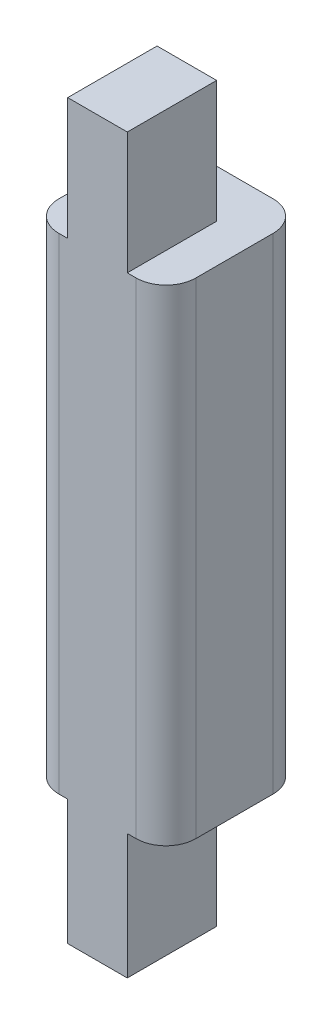
ISO-10303-21;
HEADER;
FILE_DESCRIPTION(('STEP AP214'),'2;1');
FILE_NAME('part.step','',(''),(''),'','','');
FILE_SCHEMA(('AUTOMOTIVE_DESIGN { 1 0 10303 214 1 1 1 1 }'));
ENDSEC;
DATA;
#1=APPLICATION_CONTEXT('core data for automotive mechanical design processes');
#2=APPLICATION_PROTOCOL_DEFINITION('international standard','automotive_design',2000,#1);
#3=PRODUCT_CONTEXT('',#1,'mechanical');
#4=PRODUCT('Part','Part','',(#3));
#5=PRODUCT_RELATED_PRODUCT_CATEGORY('part','',(#4));
#6=PRODUCT_DEFINITION_FORMATION('','',#4);
#7=PRODUCT_DEFINITION_CONTEXT('part definition',#1,'design');
#8=PRODUCT_DEFINITION('design','',#6,#7);
#9=PRODUCT_DEFINITION_SHAPE('','',#8);
#10=(LENGTH_UNIT() NAMED_UNIT(*) SI_UNIT(.MILLI.,.METRE.));
#11=(NAMED_UNIT(*) PLANE_ANGLE_UNIT() SI_UNIT($,.RADIAN.));
#12=(NAMED_UNIT(*) SI_UNIT($,.STERADIAN.) SOLID_ANGLE_UNIT());
#13=UNCERTAINTY_MEASURE_WITH_UNIT(LENGTH_MEASURE(1.E-05),#10,'distance_accuracy_value','');
#14=(GEOMETRIC_REPRESENTATION_CONTEXT(3) GLOBAL_UNCERTAINTY_ASSIGNED_CONTEXT((#13)) GLOBAL_UNIT_ASSIGNED_CONTEXT((#10,
#11,#12)) REPRESENTATION_CONTEXT('',''));
#15=CARTESIAN_POINT('',(0.,0.,0.));
#16=DIRECTION('',(0.,0.,1.));
#17=DIRECTION('',(1.,0.,0.));
#18=AXIS2_PLACEMENT_3D('',#15,#16,#17);
#19=CARTESIAN_POINT('',(0.,81.5,0.));
#20=DIRECTION('',(0.,1.,0.));
#21=DIRECTION('',(0.,0.,1.));
#22=AXIS2_PLACEMENT_3D('',#19,#20,#21);
#23=PLANE('',#22);
#24=DIRECTION('',(-1.,0.,0.));
#25=VECTOR('',#24,1.);
#26=CARTESIAN_POINT('',(0.,81.5,-3.5));
#27=LINE('',#26,#25);
#28=CARTESIAN_POINT('',(5.00000000000001,81.5,-3.5));
#29=VERTEX_POINT('',#28);
#30=CARTESIAN_POINT('',(-4.99999999999999,81.5,-3.5));
#31=VERTEX_POINT('',#30);
#32=EDGE_CURVE('E50',#29,#31,#27,.T.);
#33=ORIENTED_EDGE('',*,*,#32,.F.);
#34=DIRECTION('',(0.,0.,1.));
#35=VECTOR('',#34,1.);
#36=CARTESIAN_POINT('',(5.00000000000001,81.5,0.));
#37=LINE('',#36,#35);
#38=CARTESIAN_POINT('',(5.00000000000001,81.5,11.5));
#39=VERTEX_POINT('',#38);
#40=EDGE_CURVE('E11',#29,#39,#37,.T.);
#41=ORIENTED_EDGE('',*,*,#40,.T.);
#42=DIRECTION('',(1.,0.,0.));
#43=VECTOR('',#42,1.);
#44=CARTESIAN_POINT('',(0.,81.5,11.5));
#45=LINE('',#44,#43);
#46=CARTESIAN_POINT('',(6.50000000000001,81.5,11.5));
#47=VERTEX_POINT('',#46);
#48=EDGE_CURVE('E238',#39,#47,#45,.T.);
#49=ORIENTED_EDGE('',*,*,#48,.T.);
#50=CARTESIAN_POINT('',(6.50000000000001,81.5,6.5));
#51=DIRECTION('',(0.,1.,0.));
#52=DIRECTION('',(0.,0.,1.));
#53=AXIS2_PLACEMENT_3D('',#50,#51,#52);
#54=CIRCLE('',#53,5.);
#55=CARTESIAN_POINT('',(11.5,81.5,6.5));
#56=VERTEX_POINT('',#55);
#57=EDGE_CURVE('E298',#47,#56,#54,.T.);
#58=ORIENTED_EDGE('',*,*,#57,.T.);
#59=DIRECTION('',(0.,0.,-1.));
#60=VECTOR('',#59,1.);
#61=CARTESIAN_POINT('',(11.5,81.5,0.));
#62=LINE('',#61,#60);
#63=CARTESIAN_POINT('',(11.5,81.5,-6.5));
#64=VERTEX_POINT('',#63);
#65=EDGE_CURVE('E243',#56,#64,#62,.T.);
#66=ORIENTED_EDGE('',*,*,#65,.T.);
#67=CARTESIAN_POINT('',(6.50000000000001,81.5,-6.5));
#68=DIRECTION('',(0.,1.,0.));
#69=DIRECTION('',(0.,0.,1.));
#70=AXIS2_PLACEMENT_3D('',#67,#68,#69);
#71=CIRCLE('',#70,5.);
#72=CARTESIAN_POINT('',(6.50000000000001,81.5,-11.5));
#73=VERTEX_POINT('',#72);
#74=EDGE_CURVE('E292',#64,#73,#71,.T.);
#75=ORIENTED_EDGE('',*,*,#74,.T.);
#76=DIRECTION('',(1.,0.,0.));
#77=VECTOR('',#76,1.);
#78=CARTESIAN_POINT('',(0.,81.5,-11.5));
#79=LINE('',#78,#77);
#80=CARTESIAN_POINT('',(-6.5,81.5,-11.5));
#81=VERTEX_POINT('',#80);
#82=EDGE_CURVE('E247',#81,#73,#79,.T.);
#83=ORIENTED_EDGE('',*,*,#82,.F.);
#84=CARTESIAN_POINT('',(-6.5,81.5,-6.5));
#85=DIRECTION('',(0.,1.,0.));
#86=DIRECTION('',(0.,0.,1.));
#87=AXIS2_PLACEMENT_3D('',#84,#85,#86);
#88=CIRCLE('',#87,5.);
#89=CARTESIAN_POINT('',(-11.5,81.5,-6.5));
#90=VERTEX_POINT('',#89);
#91=EDGE_CURVE('E295',#81,#90,#88,.T.);
#92=ORIENTED_EDGE('',*,*,#91,.T.);
#93=DIRECTION('',(0.,0.,-1.));
#94=VECTOR('',#93,1.);
#95=CARTESIAN_POINT('',(-11.5,81.5,0.));
#96=LINE('',#95,#94);
#97=CARTESIAN_POINT('',(-11.5,81.5,6.5));
#98=VERTEX_POINT('',#97);
#99=EDGE_CURVE('E234',#98,#90,#96,.T.);
#100=ORIENTED_EDGE('',*,*,#99,.F.);
#101=CARTESIAN_POINT('',(-6.5,81.5,6.5));
#102=DIRECTION('',(0.,1.,0.));
#103=DIRECTION('',(0.,0.,1.));
#104=AXIS2_PLACEMENT_3D('',#101,#102,#103);
#105=CIRCLE('',#104,5.);
#106=CARTESIAN_POINT('',(-6.5,81.5,11.5));
#107=VERTEX_POINT('',#106);
#108=EDGE_CURVE('E301',#98,#107,#105,.T.);
#109=ORIENTED_EDGE('',*,*,#108,.T.);
#110=CARTESIAN_POINT('',(-5.,81.5,11.5));
#111=VERTEX_POINT('',#110);
#112=EDGE_CURVE('E240',#107,#111,#45,.T.);
#113=ORIENTED_EDGE('',*,*,#112,.T.);
#114=DIRECTION('',(0.,0.,1.));
#115=VECTOR('',#114,1.);
#116=CARTESIAN_POINT('',(-4.99999999999999,81.5,0.));
#117=LINE('',#116,#115);
#118=EDGE_CURVE('E60',#31,#111,#117,.T.);
#119=ORIENTED_EDGE('',*,*,#118,.F.);
#120=EDGE_LOOP('',(#33,#41,#49,#58,#66,#75,#83,#92,#100,#109,#113,#119));
#121=FACE_BOUND('',#120,.T.);
#122=ADVANCED_FACE('F41',(#121),#23,.T.);
#123=CARTESIAN_POINT('',(-11.5,81.5,0.));
#124=DIRECTION('',(-1.,0.,0.));
#125=DIRECTION('',(0.,0.,1.));
#126=AXIS2_PLACEMENT_3D('',#123,#124,#125);
#127=PLANE('',#126);
#128=DIRECTION('',(0.,0.,-1.));
#129=VECTOR('',#128,1.);
#130=CARTESIAN_POINT('',(-11.5,0.,0.));
#131=LINE('',#130,#129);
#132=CARTESIAN_POINT('',(-11.5,0.,6.5));
#133=VERTEX_POINT('',#132);
#134=CARTESIAN_POINT('',(-11.5,0.,-6.5));
#135=VERTEX_POINT('',#134);
#136=EDGE_CURVE('E222',#133,#135,#131,.T.);
#137=ORIENTED_EDGE('',*,*,#136,.F.);
#138=DIRECTION('',(0.,-1.,0.));
#139=VECTOR('',#138,1.);
#140=CARTESIAN_POINT('',(-11.5,81.5,6.5));
#141=LINE('',#140,#139);
#142=EDGE_CURVE('E289',#133,#98,#141,.F.);
#143=ORIENTED_EDGE('',*,*,#142,.T.);
#144=ORIENTED_EDGE('',*,*,#99,.T.);
#145=DIRECTION('',(0.,-1.,0.));
#146=VECTOR('',#145,1.);
#147=CARTESIAN_POINT('',(-11.5,81.5,-6.5));
#148=LINE('',#147,#146);
#149=EDGE_CURVE('E285',#90,#135,#148,.T.);
#150=ORIENTED_EDGE('',*,*,#149,.T.);
#151=EDGE_LOOP('',(#137,#143,#144,#150));
#152=FACE_BOUND('',#151,.T.);
#153=ADVANCED_FACE('F356',(#152),#127,.T.);
#154=CARTESIAN_POINT('',(0.,81.5,11.5));
#155=DIRECTION('',(0.,0.,-1.));
#156=DIRECTION('',(-1.,0.,0.));
#157=AXIS2_PLACEMENT_3D('',#154,#155,#156);
#158=PLANE('',#157);
#159=ORIENTED_EDGE('',*,*,#48,.F.);
#160=DIRECTION('',(0.,-1.,0.));
#161=VECTOR('',#160,1.);
#162=CARTESIAN_POINT('',(5.00000000000001,101.972247869612,11.5));
#163=LINE('',#162,#161);
#164=CARTESIAN_POINT('',(5.00000000000001,101.972247869612,11.5));
#165=VERTEX_POINT('',#164);
#166=EDGE_CURVE('E169',#165,#39,#163,.T.);
#167=ORIENTED_EDGE('',*,*,#166,.F.);
#168=DIRECTION('',(1.,0.,0.));
#169=VECTOR('',#168,1.);
#170=CARTESIAN_POINT('',(0.,101.972247869612,11.5));
#171=LINE('',#170,#169);
#172=CARTESIAN_POINT('',(-5.,101.972247869612,11.5));
#173=VERTEX_POINT('',#172);
#174=EDGE_CURVE('E165',#173,#165,#171,.T.);
#175=ORIENTED_EDGE('',*,*,#174,.F.);
#176=DIRECTION('',(0.,-1.,0.));
#177=VECTOR('',#176,1.);
#178=CARTESIAN_POINT('',(-5.,101.972247869612,11.5));
#179=LINE('',#178,#177);
#180=EDGE_CURVE('E151',#173,#111,#179,.T.);
#181=ORIENTED_EDGE('',*,*,#180,.T.);
#182=ORIENTED_EDGE('',*,*,#112,.F.);
#183=DIRECTION('',(0.,-1.,0.));
#184=VECTOR('',#183,1.);
#185=CARTESIAN_POINT('',(-6.5,0.,11.5));
#186=LINE('',#185,#184);
#187=CARTESIAN_POINT('',(-6.5,0.,11.5));
#188=VERTEX_POINT('',#187);
#189=EDGE_CURVE('E269',#107,#188,#186,.T.);
#190=ORIENTED_EDGE('',*,*,#189,.T.);
#191=DIRECTION('',(1.,0.,0.));
#192=VECTOR('',#191,1.);
#193=CARTESIAN_POINT('',(0.,0.,11.5));
#194=LINE('',#193,#192);
#195=CARTESIAN_POINT('',(-5.,0.,11.5));
#196=VERTEX_POINT('',#195);
#197=EDGE_CURVE('E256',#188,#196,#194,.T.);
#198=ORIENTED_EDGE('',*,*,#197,.T.);
#199=DIRECTION('',(0.,1.,0.));
#200=VECTOR('',#199,1.);
#201=CARTESIAN_POINT('',(-5.,-21.,11.5));
#202=LINE('',#201,#200);
#203=CARTESIAN_POINT('',(-5.,-21.,11.5));
#204=VERTEX_POINT('',#203);
#205=EDGE_CURVE('E218',#204,#196,#202,.T.);
#206=ORIENTED_EDGE('',*,*,#205,.F.);
#207=DIRECTION('',(1.,0.,0.));
#208=VECTOR('',#207,1.);
#209=CARTESIAN_POINT('',(0.,-21.,11.5));
#210=LINE('',#209,#208);
#211=CARTESIAN_POINT('',(5.00000000000001,-21.,11.5));
#212=VERTEX_POINT('',#211);
#213=EDGE_CURVE('E193',#204,#212,#210,.T.);
#214=ORIENTED_EDGE('',*,*,#213,.T.);
#215=DIRECTION('',(0.,1.,0.));
#216=VECTOR('',#215,1.);
#217=CARTESIAN_POINT('',(5.00000000000001,-21.,11.5));
#218=LINE('',#217,#216);
#219=CARTESIAN_POINT('',(5.00000000000001,0.,11.5));
#220=VERTEX_POINT('',#219);
#221=EDGE_CURVE('E208',#212,#220,#218,.T.);
#222=ORIENTED_EDGE('',*,*,#221,.T.);
#223=CARTESIAN_POINT('',(6.50000000000001,0.,11.5));
#224=VERTEX_POINT('',#223);
#225=EDGE_CURVE('E255',#220,#224,#194,.T.);
#226=ORIENTED_EDGE('',*,*,#225,.T.);
#227=DIRECTION('',(0.,-1.,0.));
#228=VECTOR('',#227,1.);
#229=CARTESIAN_POINT('',(6.50000000000001,81.5,11.5));
#230=LINE('',#229,#228);
#231=EDGE_CURVE('E251',#224,#47,#230,.F.);
#232=ORIENTED_EDGE('',*,*,#231,.T.);
#233=EDGE_LOOP('',(#159,#167,#175,#181,#182,#190,#198,#206,#214,#222,#226,#232));
#234=FACE_BOUND('',#233,.T.);
#235=ADVANCED_FACE('F167',(#234),#158,.F.);
#236=CARTESIAN_POINT('',(11.5,81.5,0.));
#237=DIRECTION('',(-1.,0.,0.));
#238=DIRECTION('',(0.,0.,1.));
#239=AXIS2_PLACEMENT_3D('',#236,#237,#238);
#240=PLANE('',#239);
#241=ORIENTED_EDGE('',*,*,#65,.F.);
#242=DIRECTION('',(0.,-1.,0.));
#243=VECTOR('',#242,1.);
#244=CARTESIAN_POINT('',(11.5,81.5,6.5));
#245=LINE('',#244,#243);
#246=CARTESIAN_POINT('',(11.5,0.,6.5));
#247=VERTEX_POINT('',#246);
#248=EDGE_CURVE('E307',#56,#247,#245,.T.);
#249=ORIENTED_EDGE('',*,*,#248,.T.);
#250=DIRECTION('',(0.,0.,-1.));
#251=VECTOR('',#250,1.);
#252=CARTESIAN_POINT('',(11.5,0.,0.));
#253=LINE('',#252,#251);
#254=CARTESIAN_POINT('',(11.5,0.,-6.5));
#255=VERTEX_POINT('',#254);
#256=EDGE_CURVE('E259',#247,#255,#253,.T.);
#257=ORIENTED_EDGE('',*,*,#256,.T.);
#258=DIRECTION('',(0.,-1.,0.));
#259=VECTOR('',#258,1.);
#260=CARTESIAN_POINT('',(11.5,81.5,-6.5));
#261=LINE('',#260,#259);
#262=EDGE_CURVE('E304',#255,#64,#261,.F.);
#263=ORIENTED_EDGE('',*,*,#262,.T.);
#264=EDGE_LOOP('',(#241,#249,#257,#263));
#265=FACE_BOUND('',#264,.T.);
#266=ADVANCED_FACE('F338',(#265),#240,.F.);
#267=CARTESIAN_POINT('',(0.,81.5,-11.5));
#268=DIRECTION('',(0.,0.,-1.));
#269=DIRECTION('',(-1.,0.,0.));
#270=AXIS2_PLACEMENT_3D('',#267,#268,#269);
#271=PLANE('',#270);
#272=DIRECTION('',(1.,0.,0.));
#273=VECTOR('',#272,1.);
#274=CARTESIAN_POINT('',(0.,0.,-11.5));
#275=LINE('',#274,#273);
#276=CARTESIAN_POINT('',(-6.5,0.,-11.5));
#277=VERTEX_POINT('',#276);
#278=CARTESIAN_POINT('',(6.50000000000001,0.,-11.5));
#279=VERTEX_POINT('',#278);
#280=EDGE_CURVE('E239',#277,#279,#275,.T.);
#281=ORIENTED_EDGE('',*,*,#280,.F.);
#282=DIRECTION('',(0.,-1.,0.));
#283=VECTOR('',#282,1.);
#284=CARTESIAN_POINT('',(-6.5,81.5,-11.5));
#285=LINE('',#284,#283);
#286=EDGE_CURVE('E315',#277,#81,#285,.F.);
#287=ORIENTED_EDGE('',*,*,#286,.T.);
#288=ORIENTED_EDGE('',*,*,#82,.T.);
#289=DIRECTION('',(0.,-1.,0.));
#290=VECTOR('',#289,1.);
#291=CARTESIAN_POINT('',(6.50000000000001,0.,-11.5));
#292=LINE('',#291,#290);
#293=EDGE_CURVE('E311',#73,#279,#292,.T.);
#294=ORIENTED_EDGE('',*,*,#293,.T.);
#295=EDGE_LOOP('',(#281,#287,#288,#294));
#296=FACE_BOUND('',#295,.T.);
#297=ADVANCED_FACE('F347',(#296),#271,.T.);
#298=CARTESIAN_POINT('',(0.,0.,0.));
#299=DIRECTION('',(0.,1.,0.));
#300=DIRECTION('',(0.,0.,1.));
#301=AXIS2_PLACEMENT_3D('',#298,#299,#300);
#302=PLANE('',#301);
#303=ORIENTED_EDGE('',*,*,#197,.F.);
#304=CARTESIAN_POINT('',(-6.5,0.,6.5));
#305=DIRECTION('',(0.,1.,0.));
#306=DIRECTION('',(0.,0.,1.));
#307=AXIS2_PLACEMENT_3D('',#304,#305,#306);
#308=CIRCLE('',#307,5.);
#309=EDGE_CURVE('E282',#188,#133,#308,.F.);
#310=ORIENTED_EDGE('',*,*,#309,.T.);
#311=ORIENTED_EDGE('',*,*,#136,.T.);
#312=CARTESIAN_POINT('',(-6.5,0.,-6.5));
#313=DIRECTION('',(0.,1.,0.));
#314=DIRECTION('',(0.,0.,1.));
#315=AXIS2_PLACEMENT_3D('',#312,#313,#314);
#316=CIRCLE('',#315,5.);
#317=EDGE_CURVE('E276',#135,#277,#316,.F.);
#318=ORIENTED_EDGE('',*,*,#317,.T.);
#319=ORIENTED_EDGE('',*,*,#280,.T.);
#320=CARTESIAN_POINT('',(6.50000000000001,0.,-6.5));
#321=DIRECTION('',(0.,1.,0.));
#322=DIRECTION('',(0.,0.,1.));
#323=AXIS2_PLACEMENT_3D('',#320,#321,#322);
#324=CIRCLE('',#323,5.);
#325=EDGE_CURVE('E273',#279,#255,#324,.F.);
#326=ORIENTED_EDGE('',*,*,#325,.T.);
#327=ORIENTED_EDGE('',*,*,#256,.F.);
#328=CARTESIAN_POINT('',(6.50000000000001,0.,6.5));
#329=DIRECTION('',(0.,1.,0.));
#330=DIRECTION('',(0.,0.,1.));
#331=AXIS2_PLACEMENT_3D('',#328,#329,#330);
#332=CIRCLE('',#331,5.);
#333=EDGE_CURVE('E279',#247,#224,#332,.F.);
#334=ORIENTED_EDGE('',*,*,#333,.T.);
#335=ORIENTED_EDGE('',*,*,#225,.F.);
#336=DIRECTION('',(0.,0.,-1.));
#337=VECTOR('',#336,1.);
#338=CARTESIAN_POINT('',(5.00000000000001,0.,0.));
#339=LINE('',#338,#337);
#340=CARTESIAN_POINT('',(5.00000000000001,0.,-3.5));
#341=VERTEX_POINT('',#340);
#342=EDGE_CURVE('E186',#220,#341,#339,.T.);
#343=ORIENTED_EDGE('',*,*,#342,.T.);
#344=DIRECTION('',(1.,0.,0.));
#345=VECTOR('',#344,1.);
#346=CARTESIAN_POINT('',(0.,0.,-3.5));
#347=LINE('',#346,#345);
#348=CARTESIAN_POINT('',(-4.99999999999999,0.,-3.5));
#349=VERTEX_POINT('',#348);
#350=EDGE_CURVE('E211',#349,#341,#347,.T.);
#351=ORIENTED_EDGE('',*,*,#350,.F.);
#352=DIRECTION('',(0.,0.,-1.));
#353=VECTOR('',#352,1.);
#354=CARTESIAN_POINT('',(-4.99999999999999,0.,0.));
#355=LINE('',#354,#353);
#356=EDGE_CURVE('E198',#196,#349,#355,.T.);
#357=ORIENTED_EDGE('',*,*,#356,.F.);
#358=EDGE_LOOP('',(#303,#310,#311,#318,#319,#326,#327,#334,#335,#343,#351,#357));
#359=FACE_BOUND('',#358,.T.);
#360=ADVANCED_FACE('F363',(#359),#302,.F.);
#361=CARTESIAN_POINT('',(-4.99999999999999,-21.,0.));
#362=DIRECTION('',(1.,0.,0.));
#363=DIRECTION('',(0.,0.,-1.));
#364=AXIS2_PLACEMENT_3D('',#361,#362,#363);
#365=PLANE('',#364);
#366=ORIENTED_EDGE('',*,*,#356,.T.);
#367=DIRECTION('',(0.,1.,0.));
#368=VECTOR('',#367,1.);
#369=CARTESIAN_POINT('',(-4.99999999999999,-21.,-3.5));
#370=LINE('',#369,#368);
#371=CARTESIAN_POINT('',(-4.99999999999999,-21.,-3.5));
#372=VERTEX_POINT('',#371);
#373=EDGE_CURVE('E223',#372,#349,#370,.T.);
#374=ORIENTED_EDGE('',*,*,#373,.F.);
#375=DIRECTION('',(0.,0.,-1.));
#376=VECTOR('',#375,1.);
#377=CARTESIAN_POINT('',(-4.99999999999999,-21.,0.));
#378=LINE('',#377,#376);
#379=EDGE_CURVE('E205',#204,#372,#378,.T.);
#380=ORIENTED_EDGE('',*,*,#379,.F.);
#381=ORIENTED_EDGE('',*,*,#205,.T.);
#382=EDGE_LOOP('',(#366,#374,#380,#381));
#383=FACE_BOUND('',#382,.T.);
#384=ADVANCED_FACE('F367',(#383),#365,.F.);
#385=CARTESIAN_POINT('',(0.,-21.,-3.5));
#386=DIRECTION('',(0.,0.,1.));
#387=DIRECTION('',(1.,0.,0.));
#388=AXIS2_PLACEMENT_3D('',#385,#386,#387);
#389=PLANE('',#388);
#390=ORIENTED_EDGE('',*,*,#350,.T.);
#391=DIRECTION('',(0.,1.,0.));
#392=VECTOR('',#391,1.);
#393=CARTESIAN_POINT('',(5.00000000000001,-21.,-3.5));
#394=LINE('',#393,#392);
#395=CARTESIAN_POINT('',(5.00000000000001,-21.,-3.5));
#396=VERTEX_POINT('',#395);
#397=EDGE_CURVE('E227',#396,#341,#394,.T.);
#398=ORIENTED_EDGE('',*,*,#397,.F.);
#399=DIRECTION('',(1.,0.,0.));
#400=VECTOR('',#399,1.);
#401=CARTESIAN_POINT('',(0.,-21.,-3.5));
#402=LINE('',#401,#400);
#403=EDGE_CURVE('E202',#372,#396,#402,.T.);
#404=ORIENTED_EDGE('',*,*,#403,.F.);
#405=ORIENTED_EDGE('',*,*,#373,.T.);
#406=EDGE_LOOP('',(#390,#398,#404,#405));
#407=FACE_BOUND('',#406,.T.);
#408=ADVANCED_FACE('F377',(#407),#389,.F.);
#409=CARTESIAN_POINT('',(5.00000000000001,-21.,0.));
#410=DIRECTION('',(1.,0.,0.));
#411=DIRECTION('',(0.,0.,-1.));
#412=AXIS2_PLACEMENT_3D('',#409,#410,#411);
#413=PLANE('',#412);
#414=ORIENTED_EDGE('',*,*,#342,.F.);
#415=ORIENTED_EDGE('',*,*,#221,.F.);
#416=DIRECTION('',(0.,0.,-1.));
#417=VECTOR('',#416,1.);
#418=CARTESIAN_POINT('',(5.00000000000001,-21.,0.));
#419=LINE('',#418,#417);
#420=EDGE_CURVE('E197',#212,#396,#419,.T.);
#421=ORIENTED_EDGE('',*,*,#420,.T.);
#422=ORIENTED_EDGE('',*,*,#397,.T.);
#423=EDGE_LOOP('',(#414,#415,#421,#422));
#424=FACE_BOUND('',#423,.T.);
#425=ADVANCED_FACE('F375',(#424),#413,.T.);
#426=CARTESIAN_POINT('',(0.,-21.,0.));
#427=DIRECTION('',(0.,1.,0.));
#428=DIRECTION('',(0.,0.,1.));
#429=AXIS2_PLACEMENT_3D('',#426,#427,#428);
#430=PLANE('',#429);
#431=ORIENTED_EDGE('',*,*,#213,.F.);
#432=ORIENTED_EDGE('',*,*,#379,.T.);
#433=ORIENTED_EDGE('',*,*,#403,.T.);
#434=ORIENTED_EDGE('',*,*,#420,.F.);
#435=EDGE_LOOP('',(#431,#432,#433,#434));
#436=FACE_BOUND('',#435,.T.);
#437=ADVANCED_FACE('F371',(#436),#430,.F.);
#438=CARTESIAN_POINT('',(-6.5,81.5,6.5));
#439=DIRECTION('',(0.,1.,0.));
#440=DIRECTION('',(0.,0.,1.));
#441=AXIS2_PLACEMENT_3D('',#438,#439,#440);
#442=CYLINDRICAL_SURFACE('',#441,5.);
#443=ORIENTED_EDGE('',*,*,#108,.F.);
#444=ORIENTED_EDGE('',*,*,#142,.F.);
#445=ORIENTED_EDGE('',*,*,#309,.F.);
#446=ORIENTED_EDGE('',*,*,#189,.F.);
#447=EDGE_LOOP('',(#443,#444,#445,#446));
#448=FACE_BOUND('',#447,.T.);
#449=ADVANCED_FACE('F359',(#448),#442,.T.);
#450=CARTESIAN_POINT('',(6.50000000000001,81.5,6.5));
#451=DIRECTION('',(0.,-1.,0.));
#452=DIRECTION('',(0.,0.,-1.));
#453=AXIS2_PLACEMENT_3D('',#450,#451,#452);
#454=CYLINDRICAL_SURFACE('',#453,5.);
#455=ORIENTED_EDGE('',*,*,#57,.F.);
#456=ORIENTED_EDGE('',*,*,#231,.F.);
#457=ORIENTED_EDGE('',*,*,#333,.F.);
#458=ORIENTED_EDGE('',*,*,#248,.F.);
#459=EDGE_LOOP('',(#455,#456,#457,#458));
#460=FACE_BOUND('',#459,.T.);
#461=ADVANCED_FACE('F333',(#460),#454,.T.);
#462=CARTESIAN_POINT('',(-6.5,81.5,-6.5));
#463=DIRECTION('',(0.,-1.,0.));
#464=DIRECTION('',(0.,0.,-1.));
#465=AXIS2_PLACEMENT_3D('',#462,#463,#464);
#466=CYLINDRICAL_SURFACE('',#465,5.);
#467=ORIENTED_EDGE('',*,*,#91,.F.);
#468=ORIENTED_EDGE('',*,*,#286,.F.);
#469=ORIENTED_EDGE('',*,*,#317,.F.);
#470=ORIENTED_EDGE('',*,*,#149,.F.);
#471=EDGE_LOOP('',(#467,#468,#469,#470));
#472=FACE_BOUND('',#471,.T.);
#473=ADVANCED_FACE('F350',(#472),#466,.T.);
#474=CARTESIAN_POINT('',(6.50000000000001,81.5,-6.5));
#475=DIRECTION('',(0.,1.,0.));
#476=DIRECTION('',(0.,0.,1.));
#477=AXIS2_PLACEMENT_3D('',#474,#475,#476);
#478=CYLINDRICAL_SURFACE('',#477,5.);
#479=ORIENTED_EDGE('',*,*,#74,.F.);
#480=ORIENTED_EDGE('',*,*,#262,.F.);
#481=ORIENTED_EDGE('',*,*,#325,.F.);
#482=ORIENTED_EDGE('',*,*,#293,.F.);
#483=EDGE_LOOP('',(#479,#480,#481,#482));
#484=FACE_BOUND('',#483,.T.);
#485=ADVANCED_FACE('F43',(#484),#478,.T.);
#486=CARTESIAN_POINT('',(5.00000000000001,101.972247869612,0.));
#487=DIRECTION('',(-1.,0.,0.));
#488=DIRECTION('',(0.,0.,1.));
#489=AXIS2_PLACEMENT_3D('',#486,#487,#488);
#490=PLANE('',#489);
#491=ORIENTED_EDGE('',*,*,#40,.F.);
#492=DIRECTION('',(0.,-1.,0.));
#493=VECTOR('',#492,1.);
#494=CARTESIAN_POINT('',(5.00000000000001,101.972247869612,-3.5));
#495=LINE('',#494,#493);
#496=CARTESIAN_POINT('',(5.00000000000001,101.972247869612,-3.5));
#497=VERTEX_POINT('',#496);
#498=EDGE_CURVE('E187',#497,#29,#495,.T.);
#499=ORIENTED_EDGE('',*,*,#498,.F.);
#500=DIRECTION('',(0.,0.,-1.));
#501=VECTOR('',#500,1.);
#502=CARTESIAN_POINT('',(5.00000000000001,101.972247869612,0.));
#503=LINE('',#502,#501);
#504=EDGE_CURVE('E161',#165,#497,#503,.T.);
#505=ORIENTED_EDGE('',*,*,#504,.F.);
#506=ORIENTED_EDGE('',*,*,#166,.T.);
#507=EDGE_LOOP('',(#491,#499,#505,#506));
#508=FACE_BOUND('',#507,.T.);
#509=ADVANCED_FACE('F324',(#508),#490,.F.);
#510=CARTESIAN_POINT('',(0.,101.972247869612,-3.5));
#511=DIRECTION('',(0.,0.,-1.));
#512=DIRECTION('',(-1.,0.,0.));
#513=AXIS2_PLACEMENT_3D('',#510,#511,#512);
#514=PLANE('',#513);
#515=ORIENTED_EDGE('',*,*,#498,.T.);
#516=ORIENTED_EDGE('',*,*,#32,.T.);
#517=DIRECTION('',(0.,-1.,0.));
#518=VECTOR('',#517,1.);
#519=CARTESIAN_POINT('',(-4.99999999999999,101.972247869612,-3.5));
#520=LINE('',#519,#518);
#521=CARTESIAN_POINT('',(-4.99999999999999,101.972247869612,-3.5));
#522=VERTEX_POINT('',#521);
#523=EDGE_CURVE('E160',#522,#31,#520,.T.);
#524=ORIENTED_EDGE('',*,*,#523,.F.);
#525=DIRECTION('',(1.,0.,0.));
#526=VECTOR('',#525,1.);
#527=CARTESIAN_POINT('',(0.,101.972247869612,-3.5));
#528=LINE('',#527,#526);
#529=EDGE_CURVE('E176',#522,#497,#528,.T.);
#530=ORIENTED_EDGE('',*,*,#529,.T.);
#531=EDGE_LOOP('',(#515,#516,#524,#530));
#532=FACE_BOUND('',#531,.T.);
#533=ADVANCED_FACE('F321',(#532),#514,.T.);
#534=CARTESIAN_POINT('',(-4.99999999999999,101.972247869612,0.));
#535=DIRECTION('',(-1.,0.,0.));
#536=DIRECTION('',(0.,0.,1.));
#537=AXIS2_PLACEMENT_3D('',#534,#535,#536);
#538=PLANE('',#537);
#539=ORIENTED_EDGE('',*,*,#523,.T.);
#540=ORIENTED_EDGE('',*,*,#118,.T.);
#541=ORIENTED_EDGE('',*,*,#180,.F.);
#542=DIRECTION('',(0.,0.,-1.));
#543=VECTOR('',#542,1.);
#544=CARTESIAN_POINT('',(-4.99999999999999,101.972247869612,0.));
#545=LINE('',#544,#543);
#546=EDGE_CURVE('E156',#173,#522,#545,.T.);
#547=ORIENTED_EDGE('',*,*,#546,.T.);
#548=EDGE_LOOP('',(#539,#540,#541,#547));
#549=FACE_BOUND('',#548,.T.);
#550=ADVANCED_FACE('F154',(#549),#538,.T.);
#551=CARTESIAN_POINT('',(0.,101.972247869612,0.));
#552=DIRECTION('',(0.,-1.,0.));
#553=DIRECTION('',(0.,0.,1.));
#554=AXIS2_PLACEMENT_3D('',#551,#552,#553);
#555=PLANE('',#554);
#556=ORIENTED_EDGE('',*,*,#174,.T.);
#557=ORIENTED_EDGE('',*,*,#504,.T.);
#558=ORIENTED_EDGE('',*,*,#529,.F.);
#559=ORIENTED_EDGE('',*,*,#546,.F.);
#560=EDGE_LOOP('',(#556,#557,#558,#559));
#561=FACE_BOUND('',#560,.T.);
#562=ADVANCED_FACE('F174',(#561),#555,.F.);
#563=CLOSED_SHELL('',(#122,#153,#235,#266,#297,#360,#384,#408,#425,#437,#449,#461,#473,#485,
#509,#533,#550,#562));
#564=MANIFOLD_SOLID_BREP('B2',#563);
#565=ADVANCED_BREP_SHAPE_REPRESENTATION('',(#18,#564),#14);
#566=SHAPE_DEFINITION_REPRESENTATION(#9,#565);
ENDSEC;
END-ISO-10303-21;
